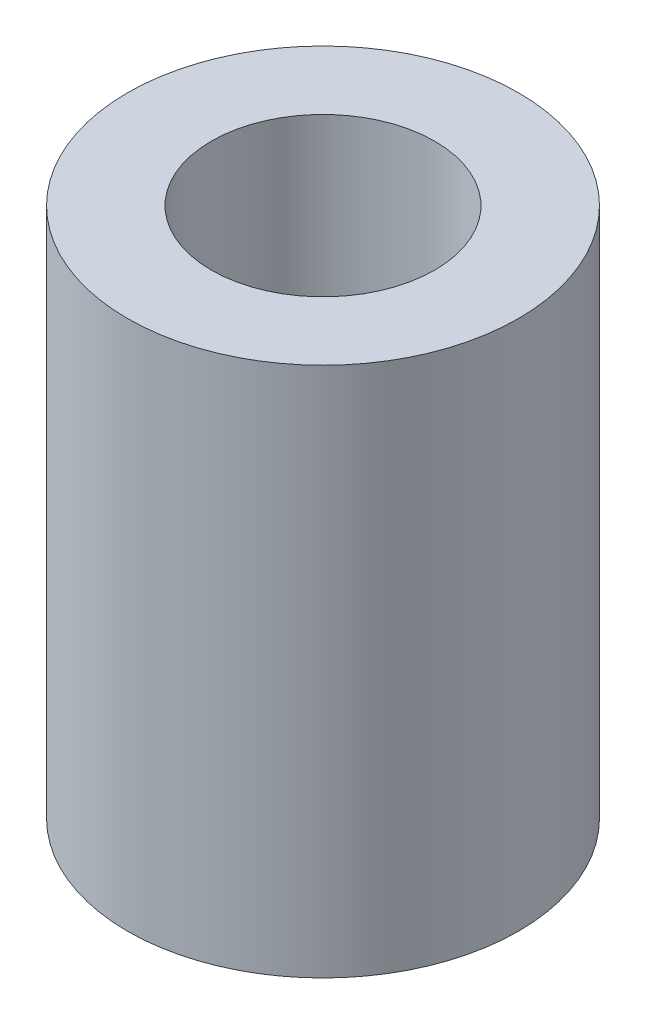
ISO-10303-21;
HEADER;
FILE_DESCRIPTION(('STEP AP214'),'2;1');
FILE_NAME('part.step','',(''),(''),'','','');
FILE_SCHEMA(('AUTOMOTIVE_DESIGN { 1 0 10303 214 1 1 1 1 }'));
ENDSEC;
DATA;
#1=APPLICATION_CONTEXT('core data for automotive mechanical design processes');
#2=APPLICATION_PROTOCOL_DEFINITION('international standard','automotive_design',2000,#1);
#3=PRODUCT_CONTEXT('',#1,'mechanical');
#4=PRODUCT('Part','Part','',(#3));
#5=PRODUCT_RELATED_PRODUCT_CATEGORY('part','',(#4));
#6=PRODUCT_DEFINITION_FORMATION('','',#4);
#7=PRODUCT_DEFINITION_CONTEXT('part definition',#1,'design');
#8=PRODUCT_DEFINITION('design','',#6,#7);
#9=PRODUCT_DEFINITION_SHAPE('','',#8);
#10=(LENGTH_UNIT() NAMED_UNIT(*) SI_UNIT(.MILLI.,.METRE.));
#11=(NAMED_UNIT(*) PLANE_ANGLE_UNIT() SI_UNIT($,.RADIAN.));
#12=(NAMED_UNIT(*) SI_UNIT($,.STERADIAN.) SOLID_ANGLE_UNIT());
#13=UNCERTAINTY_MEASURE_WITH_UNIT(LENGTH_MEASURE(1.E-05),#10,'distance_accuracy_value','');
#14=(GEOMETRIC_REPRESENTATION_CONTEXT(3) GLOBAL_UNCERTAINTY_ASSIGNED_CONTEXT((#13)) GLOBAL_UNIT_ASSIGNED_CONTEXT((#10,
#11,#12)) REPRESENTATION_CONTEXT('',''));
#15=CARTESIAN_POINT('',(0.,0.,0.));
#16=DIRECTION('',(0.,0.,1.));
#17=DIRECTION('',(1.,0.,0.));
#18=AXIS2_PLACEMENT_3D('',#15,#16,#17);
#19=CARTESIAN_POINT('',(0.,9.5,0.));
#20=DIRECTION('',(0.,1.,0.));
#21=DIRECTION('',(0.,0.,1.));
#22=AXIS2_PLACEMENT_3D('',#19,#20,#21);
#23=PLANE('',#22);
#24=CARTESIAN_POINT('',(0.,9.5,0.));
#25=DIRECTION('',(0.,1.,0.));
#26=DIRECTION('',(0.,0.,1.));
#27=AXIS2_PLACEMENT_3D('',#24,#25,#26);
#28=CIRCLE('',#27,3.5);
#29=CARTESIAN_POINT('',(0.,9.5,3.5));
#30=VERTEX_POINT('',#29);
#31=EDGE_CURVE('E10',#30,#30,#28,.T.);
#32=ORIENTED_EDGE('',*,*,#31,.T.);
#33=EDGE_LOOP('',(#32));
#34=FACE_BOUND('',#33,.T.);
#35=CARTESIAN_POINT('',(0.,9.5,0.));
#36=DIRECTION('',(0.,1.,0.));
#37=DIRECTION('',(0.,0.,1.));
#38=AXIS2_PLACEMENT_3D('',#35,#36,#37);
#39=CIRCLE('',#38,2.);
#40=CARTESIAN_POINT('',(0.,9.5,2.));
#41=VERTEX_POINT('',#40);
#42=EDGE_CURVE('E51',#41,#41,#39,.T.);
#43=ORIENTED_EDGE('',*,*,#42,.F.);
#44=EDGE_LOOP('',(#43));
#45=FACE_BOUND('',#44,.T.);
#46=ADVANCED_FACE('F38',(#34,#45),#23,.T.);
#47=CARTESIAN_POINT('',(0.,0.,0.));
#48=DIRECTION('',(0.,1.,0.));
#49=DIRECTION('',(0.,0.,1.));
#50=AXIS2_PLACEMENT_3D('',#47,#48,#49);
#51=PLANE('',#50);
#52=CARTESIAN_POINT('',(0.,0.,0.));
#53=DIRECTION('',(0.,1.,0.));
#54=DIRECTION('',(0.,0.,1.));
#55=AXIS2_PLACEMENT_3D('',#52,#53,#54);
#56=CIRCLE('',#55,3.5);
#57=CARTESIAN_POINT('',(0.,0.,3.5));
#58=VERTEX_POINT('',#57);
#59=EDGE_CURVE('E42',#58,#58,#56,.T.);
#60=ORIENTED_EDGE('',*,*,#59,.F.);
#61=EDGE_LOOP('',(#60));
#62=FACE_BOUND('',#61,.T.);
#63=CARTESIAN_POINT('',(0.,0.,0.));
#64=DIRECTION('',(0.,1.,0.));
#65=DIRECTION('',(0.,0.,1.));
#66=AXIS2_PLACEMENT_3D('',#63,#64,#65);
#67=CIRCLE('',#66,2.);
#68=CARTESIAN_POINT('',(0.,0.,2.));
#69=VERTEX_POINT('',#68);
#70=EDGE_CURVE('E53',#69,#69,#67,.T.);
#71=ORIENTED_EDGE('',*,*,#70,.T.);
#72=EDGE_LOOP('',(#71));
#73=FACE_BOUND('',#72,.T.);
#74=ADVANCED_FACE('F65',(#62,#73),#51,.F.);
#75=CARTESIAN_POINT('',(0.,9.5,0.));
#76=DIRECTION('',(0.,-1.,0.));
#77=DIRECTION('',(0.,0.,-1.));
#78=AXIS2_PLACEMENT_3D('',#75,#76,#77);
#79=CYLINDRICAL_SURFACE('',#78,3.5);
#80=ORIENTED_EDGE('',*,*,#31,.F.);
#81=EDGE_LOOP('',(#80));
#82=FACE_BOUND('',#81,.T.);
#83=ORIENTED_EDGE('',*,*,#59,.T.);
#84=EDGE_LOOP('',(#83));
#85=FACE_BOUND('',#84,.T.);
#86=ADVANCED_FACE('F40',(#82,#85),#79,.T.);
#87=CARTESIAN_POINT('',(0.,9.5,0.));
#88=DIRECTION('',(0.,-1.,0.));
#89=DIRECTION('',(0.,0.,-1.));
#90=AXIS2_PLACEMENT_3D('',#87,#88,#89);
#91=CYLINDRICAL_SURFACE('',#90,2.);
#92=ORIENTED_EDGE('',*,*,#42,.T.);
#93=EDGE_LOOP('',(#92));
#94=FACE_BOUND('',#93,.T.);
#95=ORIENTED_EDGE('',*,*,#70,.F.);
#96=EDGE_LOOP('',(#95));
#97=FACE_BOUND('',#96,.T.);
#98=ADVANCED_FACE('F61',(#94,#97),#91,.F.);
#99=CLOSED_SHELL('',(#46,#74,#86,#98));
#100=MANIFOLD_SOLID_BREP('B2',#99);
#101=ADVANCED_BREP_SHAPE_REPRESENTATION('',(#18,#100),#14);
#102=SHAPE_DEFINITION_REPRESENTATION(#9,#101);
ENDSEC;
END-ISO-10303-21;
